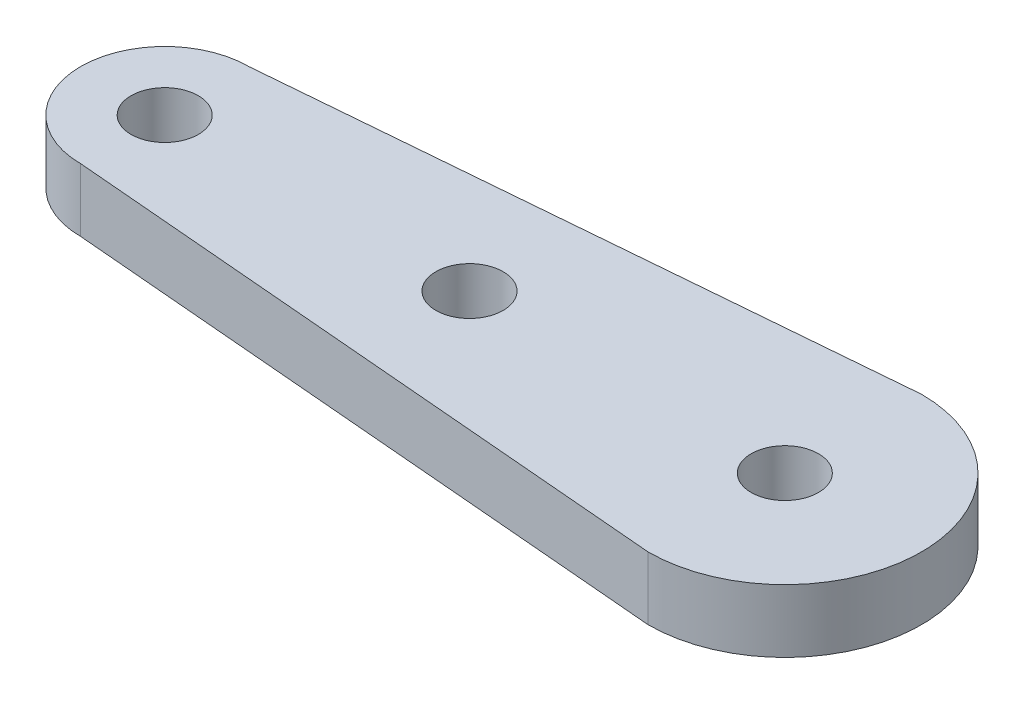
ISO-10303-21;
HEADER;
FILE_DESCRIPTION(('STEP AP214'),'2;1');
FILE_NAME('part.step','',(''),(''),'','','');
FILE_SCHEMA(('AUTOMOTIVE_DESIGN { 1 0 10303 214 1 1 1 1 }'));
ENDSEC;
DATA;
#1=APPLICATION_CONTEXT('core data for automotive mechanical design processes');
#2=APPLICATION_PROTOCOL_DEFINITION('international standard','automotive_design',2000,#1);
#3=PRODUCT_CONTEXT('',#1,'mechanical');
#4=PRODUCT('Part','Part','',(#3));
#5=PRODUCT_RELATED_PRODUCT_CATEGORY('part','',(#4));
#6=PRODUCT_DEFINITION_FORMATION('','',#4);
#7=PRODUCT_DEFINITION_CONTEXT('part definition',#1,'design');
#8=PRODUCT_DEFINITION('design','',#6,#7);
#9=PRODUCT_DEFINITION_SHAPE('','',#8);
#10=(LENGTH_UNIT() NAMED_UNIT(*) SI_UNIT(.MILLI.,.METRE.));
#11=(NAMED_UNIT(*) PLANE_ANGLE_UNIT() SI_UNIT($,.RADIAN.));
#12=(NAMED_UNIT(*) SI_UNIT($,.STERADIAN.) SOLID_ANGLE_UNIT());
#13=UNCERTAINTY_MEASURE_WITH_UNIT(LENGTH_MEASURE(1.E-05),#10,'distance_accuracy_value','');
#14=(GEOMETRIC_REPRESENTATION_CONTEXT(3) GLOBAL_UNCERTAINTY_ASSIGNED_CONTEXT((#13)) GLOBAL_UNIT_ASSIGNED_CONTEXT((#10,
#11,#12)) REPRESENTATION_CONTEXT('',''));
#15=CARTESIAN_POINT('',(0.,0.,0.));
#16=DIRECTION('',(0.,0.,1.));
#17=DIRECTION('',(1.,0.,0.));
#18=AXIS2_PLACEMENT_3D('',#15,#16,#17);
#19=CARTESIAN_POINT('',(0.,3.,0.));
#20=DIRECTION('',(0.,1.,0.));
#21=DIRECTION('',(0.,0.,1.));
#22=AXIS2_PLACEMENT_3D('',#19,#20,#21);
#23=PLANE('',#22);
#24=CARTESIAN_POINT('',(-15.,3.,0.));
#25=DIRECTION('',(0.,1.,0.));
#26=DIRECTION('',(0.,0.,1.));
#27=AXIS2_PLACEMENT_3D('',#24,#25,#26);
#28=CIRCLE('',#27,1.6);
#29=CARTESIAN_POINT('',(-15.,3.,1.6));
#30=VERTEX_POINT('',#29);
#31=EDGE_CURVE('E118',#30,#30,#28,.T.);
#32=ORIENTED_EDGE('',*,*,#31,.F.);
#33=EDGE_LOOP('',(#32));
#34=FACE_BOUND('',#33,.T.);
#35=CARTESIAN_POINT('',(0.,3.,0.));
#36=DIRECTION('',(0.,1.,0.));
#37=DIRECTION('',(0.,0.,1.));
#38=AXIS2_PLACEMENT_3D('',#35,#36,#37);
#39=CIRCLE('',#38,6.5);
#40=CARTESIAN_POINT('',(0.,3.,6.5));
#41=VERTEX_POINT('',#40);
#42=CARTESIAN_POINT('',(0.,3.,-6.5));
#43=VERTEX_POINT('',#42);
#44=EDGE_CURVE('E88',#41,#43,#39,.T.);
#45=ORIENTED_EDGE('',*,*,#44,.T.);
#46=DIRECTION('',(-0.996428304896931,0.,0.0844430766861807));
#47=VECTOR('',#46,1.);
#48=CARTESIAN_POINT('',(0.,3.,-6.5));
#49=LINE('',#48,#47);
#50=CARTESIAN_POINT('',(-29.5,3.,-4.));
#51=VERTEX_POINT('',#50);
#52=EDGE_CURVE('E83',#43,#51,#49,.T.);
#53=ORIENTED_EDGE('',*,*,#52,.T.);
#54=CARTESIAN_POINT('',(-29.5,3.,0.));
#55=DIRECTION('',(0.,1.,0.));
#56=DIRECTION('',(0.,0.,1.));
#57=AXIS2_PLACEMENT_3D('',#54,#55,#56);
#58=CIRCLE('',#57,4.);
#59=CARTESIAN_POINT('',(-29.5,3.,4.));
#60=VERTEX_POINT('',#59);
#61=EDGE_CURVE('E86',#51,#60,#58,.T.);
#62=ORIENTED_EDGE('',*,*,#61,.T.);
#63=DIRECTION('',(0.996428304896931,0.,0.0844430766861807));
#64=VECTOR('',#63,1.);
#65=CARTESIAN_POINT('',(-29.5,3.,4.));
#66=LINE('',#65,#64);
#67=EDGE_CURVE('E53',#60,#41,#66,.T.);
#68=ORIENTED_EDGE('',*,*,#67,.T.);
#69=EDGE_LOOP('',(#45,#53,#62,#68));
#70=FACE_BOUND('',#69,.T.);
#71=CARTESIAN_POINT('',(0.,3.,0.));
#72=DIRECTION('',(0.,1.,0.));
#73=DIRECTION('',(0.,0.,1.));
#74=AXIS2_PLACEMENT_3D('',#71,#72,#73);
#75=CIRCLE('',#74,1.6);
#76=CARTESIAN_POINT('',(0.,3.,1.6));
#77=VERTEX_POINT('',#76);
#78=EDGE_CURVE('E103',#77,#77,#75,.T.);
#79=ORIENTED_EDGE('',*,*,#78,.F.);
#80=EDGE_LOOP('',(#79));
#81=FACE_BOUND('',#80,.T.);
#82=CARTESIAN_POINT('',(-29.5,3.,0.));
#83=DIRECTION('',(0.,1.,0.));
#84=DIRECTION('',(0.,0.,1.));
#85=AXIS2_PLACEMENT_3D('',#82,#83,#84);
#86=CIRCLE('',#85,1.6);
#87=CARTESIAN_POINT('',(-29.5,3.,1.6));
#88=VERTEX_POINT('',#87);
#89=EDGE_CURVE('E124',#88,#88,#86,.T.);
#90=ORIENTED_EDGE('',*,*,#89,.F.);
#91=EDGE_LOOP('',(#90));
#92=FACE_BOUND('',#91,.T.);
#93=ADVANCED_FACE('F36',(#34,#70,#81,#92),#23,.T.);
#94=CARTESIAN_POINT('',(0.,0.,0.));
#95=DIRECTION('',(0.,1.,0.));
#96=DIRECTION('',(0.,0.,1.));
#97=AXIS2_PLACEMENT_3D('',#94,#95,#96);
#98=PLANE('',#97);
#99=CARTESIAN_POINT('',(0.,0.,0.));
#100=DIRECTION('',(0.,1.,0.));
#101=DIRECTION('',(0.,0.,1.));
#102=AXIS2_PLACEMENT_3D('',#99,#100,#101);
#103=CIRCLE('',#102,6.5);
#104=CARTESIAN_POINT('',(0.,0.,6.5));
#105=VERTEX_POINT('',#104);
#106=CARTESIAN_POINT('',(0.,0.,-6.5));
#107=VERTEX_POINT('',#106);
#108=EDGE_CURVE('E100',#105,#107,#103,.T.);
#109=ORIENTED_EDGE('',*,*,#108,.F.);
#110=DIRECTION('',(0.996428304896931,0.,0.0844430766861807));
#111=VECTOR('',#110,1.);
#112=CARTESIAN_POINT('',(-29.5,0.,4.));
#113=LINE('',#112,#111);
#114=CARTESIAN_POINT('',(-29.5,0.,4.));
#115=VERTEX_POINT('',#114);
#116=EDGE_CURVE('E76',#115,#105,#113,.T.);
#117=ORIENTED_EDGE('',*,*,#116,.F.);
#118=CARTESIAN_POINT('',(-29.5,0.,0.));
#119=DIRECTION('',(0.,1.,0.));
#120=DIRECTION('',(0.,0.,1.));
#121=AXIS2_PLACEMENT_3D('',#118,#119,#120);
#122=CIRCLE('',#121,4.);
#123=CARTESIAN_POINT('',(-29.5,0.,-4.));
#124=VERTEX_POINT('',#123);
#125=EDGE_CURVE('E70',#124,#115,#122,.T.);
#126=ORIENTED_EDGE('',*,*,#125,.F.);
#127=DIRECTION('',(-0.996428304896931,0.,0.0844430766861807));
#128=VECTOR('',#127,1.);
#129=CARTESIAN_POINT('',(0.,0.,-6.5));
#130=LINE('',#129,#128);
#131=EDGE_CURVE('E92',#107,#124,#130,.T.);
#132=ORIENTED_EDGE('',*,*,#131,.F.);
#133=EDGE_LOOP('',(#109,#117,#126,#132));
#134=FACE_BOUND('',#133,.T.);
#135=CARTESIAN_POINT('',(0.,0.,0.));
#136=DIRECTION('',(0.,1.,0.));
#137=DIRECTION('',(0.,0.,1.));
#138=AXIS2_PLACEMENT_3D('',#135,#136,#137);
#139=CIRCLE('',#138,1.6);
#140=CARTESIAN_POINT('',(0.,0.,1.6));
#141=VERTEX_POINT('',#140);
#142=EDGE_CURVE('E115',#141,#141,#139,.T.);
#143=ORIENTED_EDGE('',*,*,#142,.T.);
#144=EDGE_LOOP('',(#143));
#145=FACE_BOUND('',#144,.T.);
#146=CARTESIAN_POINT('',(-15.,0.,0.));
#147=DIRECTION('',(0.,1.,0.));
#148=DIRECTION('',(0.,0.,1.));
#149=AXIS2_PLACEMENT_3D('',#146,#147,#148);
#150=CIRCLE('',#149,1.6);
#151=CARTESIAN_POINT('',(-15.,0.,1.6));
#152=VERTEX_POINT('',#151);
#153=EDGE_CURVE('E121',#152,#152,#150,.T.);
#154=ORIENTED_EDGE('',*,*,#153,.T.);
#155=EDGE_LOOP('',(#154));
#156=FACE_BOUND('',#155,.T.);
#157=CARTESIAN_POINT('',(-29.5,0.,0.));
#158=DIRECTION('',(0.,1.,0.));
#159=DIRECTION('',(0.,0.,1.));
#160=AXIS2_PLACEMENT_3D('',#157,#158,#159);
#161=CIRCLE('',#160,1.6);
#162=CARTESIAN_POINT('',(-29.5,0.,1.6));
#163=VERTEX_POINT('',#162);
#164=EDGE_CURVE('E127',#163,#163,#161,.T.);
#165=ORIENTED_EDGE('',*,*,#164,.T.);
#166=EDGE_LOOP('',(#165));
#167=FACE_BOUND('',#166,.T.);
#168=ADVANCED_FACE('F111',(#134,#145,#156,#167),#98,.F.);
#169=CARTESIAN_POINT('',(0.,3.,0.));
#170=DIRECTION('',(0.,-1.,0.));
#171=DIRECTION('',(0.,0.,-1.));
#172=AXIS2_PLACEMENT_3D('',#169,#170,#171);
#173=CYLINDRICAL_SURFACE('',#172,6.5);
#174=ORIENTED_EDGE('',*,*,#108,.T.);
#175=DIRECTION('',(0.,-1.,0.));
#176=VECTOR('',#175,1.);
#177=CARTESIAN_POINT('',(0.,3.,-6.5));
#178=LINE('',#177,#176);
#179=EDGE_CURVE('E11',#43,#107,#178,.T.);
#180=ORIENTED_EDGE('',*,*,#179,.F.);
#181=ORIENTED_EDGE('',*,*,#44,.F.);
#182=DIRECTION('',(0.,-1.,0.));
#183=VECTOR('',#182,1.);
#184=CARTESIAN_POINT('',(0.,3.,6.5));
#185=LINE('',#184,#183);
#186=EDGE_CURVE('E96',#41,#105,#185,.T.);
#187=ORIENTED_EDGE('',*,*,#186,.T.);
#188=EDGE_LOOP('',(#174,#180,#181,#187));
#189=FACE_BOUND('',#188,.T.);
#190=ADVANCED_FACE('F38',(#189),#173,.T.);
#191=CARTESIAN_POINT('',(0.,3.,-6.5));
#192=DIRECTION('',(0.0844430766861807,0.,0.996428304896931));
#193=DIRECTION('',(0.996428304896931,0.,-0.0844430766861807));
#194=AXIS2_PLACEMENT_3D('',#191,#192,#193);
#195=PLANE('',#194);
#196=ORIENTED_EDGE('',*,*,#131,.T.);
#197=DIRECTION('',(0.,-1.,0.));
#198=VECTOR('',#197,1.);
#199=CARTESIAN_POINT('',(-29.5,3.,-4.));
#200=LINE('',#199,#198);
#201=EDGE_CURVE('E45',#51,#124,#200,.T.);
#202=ORIENTED_EDGE('',*,*,#201,.F.);
#203=ORIENTED_EDGE('',*,*,#52,.F.);
#204=ORIENTED_EDGE('',*,*,#179,.T.);
#205=EDGE_LOOP('',(#196,#202,#203,#204));
#206=FACE_BOUND('',#205,.T.);
#207=ADVANCED_FACE('F91',(#206),#195,.F.);
#208=CARTESIAN_POINT('',(-29.5,3.,0.));
#209=DIRECTION('',(0.,-1.,0.));
#210=DIRECTION('',(0.,0.,-1.));
#211=AXIS2_PLACEMENT_3D('',#208,#209,#210);
#212=CYLINDRICAL_SURFACE('',#211,4.);
#213=ORIENTED_EDGE('',*,*,#125,.T.);
#214=DIRECTION('',(0.,-1.,0.));
#215=VECTOR('',#214,1.);
#216=CARTESIAN_POINT('',(-29.5,3.,4.));
#217=LINE('',#216,#215);
#218=EDGE_CURVE('E93',#60,#115,#217,.T.);
#219=ORIENTED_EDGE('',*,*,#218,.F.);
#220=ORIENTED_EDGE('',*,*,#61,.F.);
#221=ORIENTED_EDGE('',*,*,#201,.T.);
#222=EDGE_LOOP('',(#213,#219,#220,#221));
#223=FACE_BOUND('',#222,.T.);
#224=ADVANCED_FACE('F94',(#223),#212,.T.);
#225=CARTESIAN_POINT('',(-29.5,3.,4.));
#226=DIRECTION('',(0.0844430766861807,0.,-0.996428304896931));
#227=DIRECTION('',(-0.996428304896931,0.,-0.0844430766861807));
#228=AXIS2_PLACEMENT_3D('',#225,#226,#227);
#229=PLANE('',#228);
#230=ORIENTED_EDGE('',*,*,#116,.T.);
#231=ORIENTED_EDGE('',*,*,#186,.F.);
#232=ORIENTED_EDGE('',*,*,#67,.F.);
#233=ORIENTED_EDGE('',*,*,#218,.T.);
#234=EDGE_LOOP('',(#230,#231,#232,#233));
#235=FACE_BOUND('',#234,.T.);
#236=ADVANCED_FACE('F108',(#235),#229,.F.);
#237=CARTESIAN_POINT('',(0.,3.,0.));
#238=DIRECTION('',(0.,-1.,0.));
#239=DIRECTION('',(0.,0.,-1.));
#240=AXIS2_PLACEMENT_3D('',#237,#238,#239);
#241=CYLINDRICAL_SURFACE('',#240,1.6);
#242=ORIENTED_EDGE('',*,*,#78,.T.);
#243=EDGE_LOOP('',(#242));
#244=FACE_BOUND('',#243,.T.);
#245=ORIENTED_EDGE('',*,*,#142,.F.);
#246=EDGE_LOOP('',(#245));
#247=FACE_BOUND('',#246,.T.);
#248=ADVANCED_FACE('F145',(#244,#247),#241,.F.);
#249=CARTESIAN_POINT('',(-15.,3.,0.));
#250=DIRECTION('',(0.,-1.,0.));
#251=DIRECTION('',(0.,0.,-1.));
#252=AXIS2_PLACEMENT_3D('',#249,#250,#251);
#253=CYLINDRICAL_SURFACE('',#252,1.6);
#254=ORIENTED_EDGE('',*,*,#31,.T.);
#255=EDGE_LOOP('',(#254));
#256=FACE_BOUND('',#255,.T.);
#257=ORIENTED_EDGE('',*,*,#153,.F.);
#258=EDGE_LOOP('',(#257));
#259=FACE_BOUND('',#258,.T.);
#260=ADVANCED_FACE('F191',(#256,#259),#253,.F.);
#261=CARTESIAN_POINT('',(-29.5,3.,0.));
#262=DIRECTION('',(0.,-1.,0.));
#263=DIRECTION('',(0.,0.,-1.));
#264=AXIS2_PLACEMENT_3D('',#261,#262,#263);
#265=CYLINDRICAL_SURFACE('',#264,1.6);
#266=ORIENTED_EDGE('',*,*,#89,.T.);
#267=EDGE_LOOP('',(#266));
#268=FACE_BOUND('',#267,.T.);
#269=ORIENTED_EDGE('',*,*,#164,.F.);
#270=EDGE_LOOP('',(#269));
#271=FACE_BOUND('',#270,.T.);
#272=ADVANCED_FACE('F133',(#268,#271),#265,.F.);
#273=CLOSED_SHELL('',(#93,#168,#190,#207,#224,#236,#248,#260,#272));
#274=MANIFOLD_SOLID_BREP('B2',#273);
#275=ADVANCED_BREP_SHAPE_REPRESENTATION('',(#18,#274),#14);
#276=SHAPE_DEFINITION_REPRESENTATION(#9,#275);
ENDSEC;
END-ISO-10303-21;
